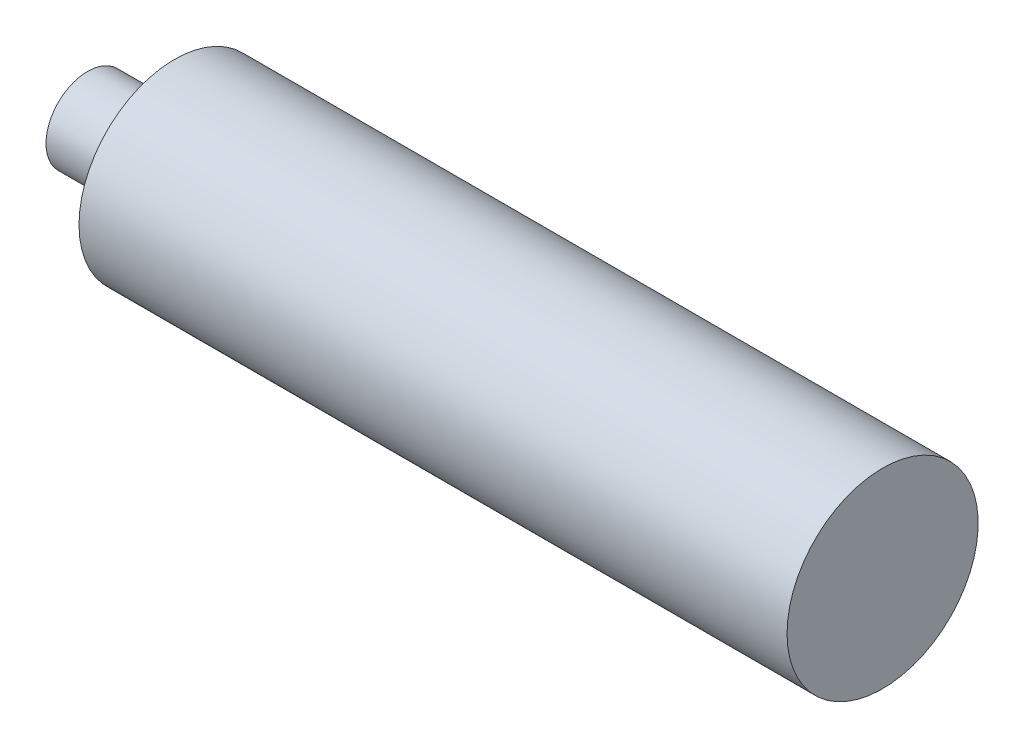
ISO-10303-21;
HEADER;
FILE_DESCRIPTION(('STEP AP214'),'2;1');
FILE_NAME('part.step','',(''),(''),'','','');
FILE_SCHEMA(('AUTOMOTIVE_DESIGN { 1 0 10303 214 1 1 1 1 }'));
ENDSEC;
DATA;
#1=APPLICATION_CONTEXT('core data for automotive mechanical design processes');
#2=APPLICATION_PROTOCOL_DEFINITION('international standard','automotive_design',2000,#1);
#3=PRODUCT_CONTEXT('',#1,'mechanical');
#4=PRODUCT('Part','Part','',(#3));
#5=PRODUCT_RELATED_PRODUCT_CATEGORY('part','',(#4));
#6=PRODUCT_DEFINITION_FORMATION('','',#4);
#7=PRODUCT_DEFINITION_CONTEXT('part definition',#1,'design');
#8=PRODUCT_DEFINITION('design','',#6,#7);
#9=PRODUCT_DEFINITION_SHAPE('','',#8);
#10=(LENGTH_UNIT() NAMED_UNIT(*) SI_UNIT(.MILLI.,.METRE.));
#11=(NAMED_UNIT(*) PLANE_ANGLE_UNIT() SI_UNIT($,.RADIAN.));
#12=(NAMED_UNIT(*) SI_UNIT($,.STERADIAN.) SOLID_ANGLE_UNIT());
#13=UNCERTAINTY_MEASURE_WITH_UNIT(LENGTH_MEASURE(1.E-05),#10,'distance_accuracy_value','');
#14=(GEOMETRIC_REPRESENTATION_CONTEXT(3) GLOBAL_UNCERTAINTY_ASSIGNED_CONTEXT((#13)) GLOBAL_UNIT_ASSIGNED_CONTEXT((#10,
#11,#12)) REPRESENTATION_CONTEXT('',''));
#15=CARTESIAN_POINT('',(0.,0.,0.));
#16=DIRECTION('',(0.,0.,1.));
#17=DIRECTION('',(1.,0.,0.));
#18=AXIS2_PLACEMENT_3D('',#15,#16,#17);
#19=CARTESIAN_POINT('',(-223.3,32.815,-139.7));
#20=DIRECTION('',(-1.,0.,0.));
#21=DIRECTION('',(0.,0.,1.));
#22=AXIS2_PLACEMENT_3D('',#19,#20,#21);
#23=CYLINDRICAL_SURFACE('',#22,11.);
#24=CARTESIAN_POINT('',(-223.3,32.815,-139.7));
#25=DIRECTION('',(-1.,0.,0.));
#26=DIRECTION('',(0.,0.,1.));
#27=AXIS2_PLACEMENT_3D('',#24,#25,#26);
#28=CIRCLE('',#27,11.);
#29=CARTESIAN_POINT('',(-223.3,32.815,-128.7));
#30=VERTEX_POINT('',#29);
#31=EDGE_CURVE('E38',#30,#30,#28,.T.);
#32=ORIENTED_EDGE('',*,*,#31,.T.);
#33=EDGE_LOOP('',(#32));
#34=FACE_BOUND('',#33,.T.);
#35=CARTESIAN_POINT('',(-304.8,32.815,-139.7));
#36=DIRECTION('',(-1.,0.,0.));
#37=DIRECTION('',(0.,0.,1.));
#38=AXIS2_PLACEMENT_3D('',#35,#36,#37);
#39=CIRCLE('',#38,11.);
#40=CARTESIAN_POINT('',(-304.8,32.815,-128.7));
#41=VERTEX_POINT('',#40);
#42=EDGE_CURVE('E34',#41,#41,#39,.T.);
#43=ORIENTED_EDGE('',*,*,#42,.F.);
#44=EDGE_LOOP('',(#43));
#45=FACE_BOUND('',#44,.T.);
#46=ADVANCED_FACE('F31',(#34,#45),#23,.T.);
#47=CARTESIAN_POINT('',(-223.3,32.815,-139.7));
#48=DIRECTION('',(-1.,0.,0.));
#49=DIRECTION('',(0.,0.,1.));
#50=AXIS2_PLACEMENT_3D('',#47,#48,#49);
#51=PLANE('',#50);
#52=ORIENTED_EDGE('',*,*,#31,.F.);
#53=EDGE_LOOP('',(#52));
#54=FACE_BOUND('',#53,.T.);
#55=ADVANCED_FACE('F54',(#54),#51,.F.);
#56=CARTESIAN_POINT('',(-304.8,32.815,-139.7));
#57=DIRECTION('',(-1.,0.,0.));
#58=DIRECTION('',(0.,0.,1.));
#59=AXIS2_PLACEMENT_3D('',#56,#57,#58);
#60=PLANE('',#59);
#61=CARTESIAN_POINT('',(-304.8,32.815,-139.7));
#62=DIRECTION('',(-1.,0.,0.));
#63=DIRECTION('',(0.,0.,1.));
#64=AXIS2_PLACEMENT_3D('',#61,#62,#63);
#65=CIRCLE('',#64,4.8);
#66=CARTESIAN_POINT('',(-304.8,32.815,-134.9));
#67=VERTEX_POINT('',#66);
#68=EDGE_CURVE('E10',#67,#67,#65,.T.);
#69=ORIENTED_EDGE('',*,*,#68,.F.);
#70=EDGE_LOOP('',(#69));
#71=FACE_BOUND('',#70,.T.);
#72=ORIENTED_EDGE('',*,*,#42,.T.);
#73=EDGE_LOOP('',(#72));
#74=FACE_BOUND('',#73,.T.);
#75=ADVANCED_FACE('F51',(#71,#74),#60,.T.);
#76=CARTESIAN_POINT('',(-314.8,32.815,-139.7));
#77=DIRECTION('',(1.,0.,0.));
#78=DIRECTION('',(0.,0.,-1.));
#79=AXIS2_PLACEMENT_3D('',#76,#77,#78);
#80=CYLINDRICAL_SURFACE('',#79,4.8);
#81=CARTESIAN_POINT('',(-314.8,32.815,-139.7));
#82=DIRECTION('',(-1.,0.,0.));
#83=DIRECTION('',(0.,0.,1.));
#84=AXIS2_PLACEMENT_3D('',#81,#82,#83);
#85=CIRCLE('',#84,4.8);
#86=CARTESIAN_POINT('',(-314.8,32.815,-134.9));
#87=VERTEX_POINT('',#86);
#88=EDGE_CURVE('E44',#87,#87,#85,.T.);
#89=ORIENTED_EDGE('',*,*,#88,.F.);
#90=EDGE_LOOP('',(#89));
#91=FACE_BOUND('',#90,.T.);
#92=ORIENTED_EDGE('',*,*,#68,.T.);
#93=EDGE_LOOP('',(#92));
#94=FACE_BOUND('',#93,.T.);
#95=ADVANCED_FACE('F65',(#91,#94),#80,.T.);
#96=CARTESIAN_POINT('',(-314.8,32.815,-139.7));
#97=DIRECTION('',(-1.,0.,0.));
#98=DIRECTION('',(0.,0.,1.));
#99=AXIS2_PLACEMENT_3D('',#96,#97,#98);
#100=PLANE('',#99);
#101=ORIENTED_EDGE('',*,*,#88,.T.);
#102=EDGE_LOOP('',(#101));
#103=FACE_BOUND('',#102,.T.);
#104=ADVANCED_FACE('F70',(#103),#100,.T.);
#105=CLOSED_SHELL('',(#46,#55,#75,#95,#104));
#106=MANIFOLD_SOLID_BREP('B2',#105);
#107=ADVANCED_BREP_SHAPE_REPRESENTATION('',(#18,#106),#14);
#108=SHAPE_DEFINITION_REPRESENTATION(#9,#107);
ENDSEC;
END-ISO-10303-21;
